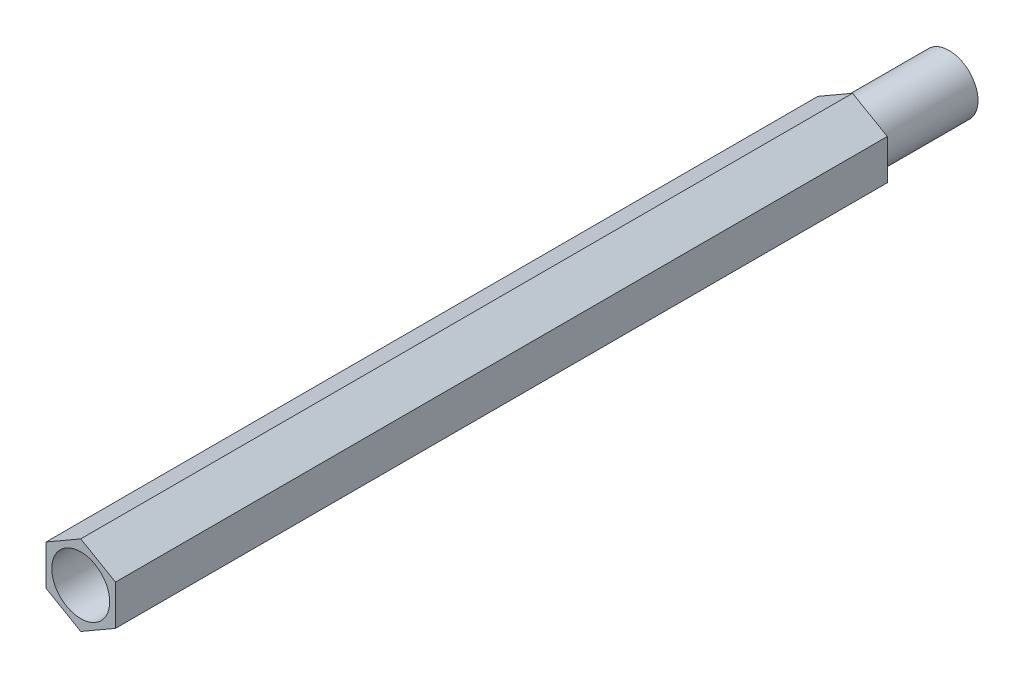
ISO-10303-21;
HEADER;
FILE_DESCRIPTION(('STEP AP214'),'2;1');
FILE_NAME('part.step','',(''),(''),'','','');
FILE_SCHEMA(('AUTOMOTIVE_DESIGN { 1 0 10303 214 1 1 1 1 }'));
ENDSEC;
DATA;
#1=APPLICATION_CONTEXT('core data for automotive mechanical design processes');
#2=APPLICATION_PROTOCOL_DEFINITION('international standard','automotive_design',2000,#1);
#3=PRODUCT_CONTEXT('',#1,'mechanical');
#4=PRODUCT('Part','Part','',(#3));
#5=PRODUCT_RELATED_PRODUCT_CATEGORY('part','',(#4));
#6=PRODUCT_DEFINITION_FORMATION('','',#4);
#7=PRODUCT_DEFINITION_CONTEXT('part definition',#1,'design');
#8=PRODUCT_DEFINITION('design','',#6,#7);
#9=PRODUCT_DEFINITION_SHAPE('','',#8);
#10=(LENGTH_UNIT() NAMED_UNIT(*) SI_UNIT(.MILLI.,.METRE.));
#11=(NAMED_UNIT(*) PLANE_ANGLE_UNIT() SI_UNIT($,.RADIAN.));
#12=(NAMED_UNIT(*) SI_UNIT($,.STERADIAN.) SOLID_ANGLE_UNIT());
#13=UNCERTAINTY_MEASURE_WITH_UNIT(LENGTH_MEASURE(1.E-05),#10,'distance_accuracy_value','');
#14=(GEOMETRIC_REPRESENTATION_CONTEXT(3) GLOBAL_UNCERTAINTY_ASSIGNED_CONTEXT((#13)) GLOBAL_UNIT_ASSIGNED_CONTEXT((#10,
#11,#12)) REPRESENTATION_CONTEXT('',''));
#15=CARTESIAN_POINT('',(0.,0.,0.));
#16=DIRECTION('',(0.,0.,1.));
#17=DIRECTION('',(1.,0.,0.));
#18=AXIS2_PLACEMENT_3D('',#15,#16,#17);
#19=CARTESIAN_POINT('',(0.,0.,40.));
#20=DIRECTION('',(0.,0.,-1.));
#21=DIRECTION('',(-1.,0.,0.));
#22=AXIS2_PLACEMENT_3D('',#19,#20,#21);
#23=CYLINDRICAL_SURFACE('',#22,1.5);
#24=CARTESIAN_POINT('',(0.,0.,40.));
#25=DIRECTION('',(0.,0.,1.));
#26=DIRECTION('',(1.,0.,0.));
#27=AXIS2_PLACEMENT_3D('',#24,#25,#26);
#28=CIRCLE('',#27,1.5);
#29=CARTESIAN_POINT('',(1.5,0.,40.));
#30=VERTEX_POINT('',#29);
#31=EDGE_CURVE('E141',#30,#30,#28,.T.);
#32=ORIENTED_EDGE('',*,*,#31,.T.);
#33=EDGE_LOOP('',(#32));
#34=FACE_BOUND('',#33,.T.);
#35=CARTESIAN_POINT('',(0.,0.,5.));
#36=DIRECTION('',(0.,0.,-1.));
#37=DIRECTION('',(-1.,0.,0.));
#38=AXIS2_PLACEMENT_3D('',#35,#36,#37);
#39=CIRCLE('',#38,1.5);
#40=CARTESIAN_POINT('',(-1.5,0.,5.));
#41=VERTEX_POINT('',#40);
#42=EDGE_CURVE('E258',#41,#41,#39,.T.);
#43=ORIENTED_EDGE('',*,*,#42,.T.);
#44=EDGE_LOOP('',(#43));
#45=FACE_BOUND('',#44,.T.);
#46=ADVANCED_FACE('F45',(#34,#45),#23,.F.);
#47=CARTESIAN_POINT('',(0.,0.,40.));
#48=DIRECTION('',(0.,0.,1.));
#49=DIRECTION('',(1.,0.,0.));
#50=AXIS2_PLACEMENT_3D('',#47,#48,#49);
#51=PLANE('',#50);
#52=DIRECTION('',(-0.866025403784439,0.5,0.));
#53=VECTOR('',#52,1.);
#54=CARTESIAN_POINT('',(1.8,1.03923048454133,40.));
#55=LINE('',#54,#53);
#56=CARTESIAN_POINT('',(1.8,1.03923048454133,40.));
#57=VERTEX_POINT('',#56);
#58=CARTESIAN_POINT('',(0.,2.07846096908265,40.));
#59=VERTEX_POINT('',#58);
#60=EDGE_CURVE('E153',#57,#59,#55,.T.);
#61=ORIENTED_EDGE('',*,*,#60,.T.);
#62=DIRECTION('',(-0.866025403784439,-0.5,0.));
#63=VECTOR('',#62,1.);
#64=CARTESIAN_POINT('',(0.,2.07846096908265,40.));
#65=LINE('',#64,#63);
#66=CARTESIAN_POINT('',(-1.8,1.03923048454133,40.));
#67=VERTEX_POINT('',#66);
#68=EDGE_CURVE('E100',#59,#67,#65,.T.);
#69=ORIENTED_EDGE('',*,*,#68,.T.);
#70=DIRECTION('',(0.,-1.,0.));
#71=VECTOR('',#70,1.);
#72=CARTESIAN_POINT('',(-1.8,1.03923048454133,40.));
#73=LINE('',#72,#71);
#74=CARTESIAN_POINT('',(-1.8,-1.03923048454133,40.));
#75=VERTEX_POINT('',#74);
#76=EDGE_CURVE('E114',#67,#75,#73,.T.);
#77=ORIENTED_EDGE('',*,*,#76,.T.);
#78=DIRECTION('',(0.866025403784439,-0.5,0.));
#79=VECTOR('',#78,1.);
#80=CARTESIAN_POINT('',(-1.8,-1.03923048454133,40.));
#81=LINE('',#80,#79);
#82=CARTESIAN_POINT('',(0.,-2.07846096908265,40.));
#83=VERTEX_POINT('',#82);
#84=EDGE_CURVE('E107',#75,#83,#81,.T.);
#85=ORIENTED_EDGE('',*,*,#84,.T.);
#86=DIRECTION('',(0.866025403784439,0.5,0.));
#87=VECTOR('',#86,1.);
#88=CARTESIAN_POINT('',(0.,-2.07846096908265,40.));
#89=LINE('',#88,#87);
#90=CARTESIAN_POINT('',(1.8,-1.03923048454133,40.));
#91=VERTEX_POINT('',#90);
#92=EDGE_CURVE('E112',#83,#91,#89,.T.);
#93=ORIENTED_EDGE('',*,*,#92,.T.);
#94=DIRECTION('',(0.,1.,0.));
#95=VECTOR('',#94,1.);
#96=CARTESIAN_POINT('',(1.8,-1.03923048454133,40.));
#97=LINE('',#96,#95);
#98=EDGE_CURVE('E63',#91,#57,#97,.T.);
#99=ORIENTED_EDGE('',*,*,#98,.T.);
#100=EDGE_LOOP('',(#61,#69,#77,#85,#93,#99));
#101=FACE_BOUND('',#100,.T.);
#102=ORIENTED_EDGE('',*,*,#31,.F.);
#103=EDGE_LOOP('',(#102));
#104=FACE_BOUND('',#103,.T.);
#105=ADVANCED_FACE('F109',(#101,#104),#51,.T.);
#106=CARTESIAN_POINT('',(0.,0.,0.));
#107=DIRECTION('',(0.,0.,1.));
#108=DIRECTION('',(1.,0.,0.));
#109=AXIS2_PLACEMENT_3D('',#106,#107,#108);
#110=PLANE('',#109);
#111=DIRECTION('',(-0.866025403784439,0.5,0.));
#112=VECTOR('',#111,1.);
#113=CARTESIAN_POINT('',(1.8,1.03923048454133,0.));
#114=LINE('',#113,#112);
#115=CARTESIAN_POINT('',(1.8,1.03923048454133,0.));
#116=VERTEX_POINT('',#115);
#117=CARTESIAN_POINT('',(0.,2.07846096908265,0.));
#118=VERTEX_POINT('',#117);
#119=EDGE_CURVE('E136',#116,#118,#114,.T.);
#120=ORIENTED_EDGE('',*,*,#119,.F.);
#121=DIRECTION('',(0.,1.,0.));
#122=VECTOR('',#121,1.);
#123=CARTESIAN_POINT('',(1.8,-1.03923048454133,0.));
#124=LINE('',#123,#122);
#125=CARTESIAN_POINT('',(1.8,-1.03923048454133,0.));
#126=VERTEX_POINT('',#125);
#127=EDGE_CURVE('E92',#126,#116,#124,.T.);
#128=ORIENTED_EDGE('',*,*,#127,.F.);
#129=DIRECTION('',(0.866025403784439,0.5,0.));
#130=VECTOR('',#129,1.);
#131=CARTESIAN_POINT('',(0.,-2.07846096908265,0.));
#132=LINE('',#131,#130);
#133=CARTESIAN_POINT('',(0.,-2.07846096908265,0.));
#134=VERTEX_POINT('',#133);
#135=EDGE_CURVE('E86',#134,#126,#132,.T.);
#136=ORIENTED_EDGE('',*,*,#135,.F.);
#137=DIRECTION('',(0.866025403784439,-0.5,0.));
#138=VECTOR('',#137,1.);
#139=CARTESIAN_POINT('',(-1.8,-1.03923048454133,0.));
#140=LINE('',#139,#138);
#141=CARTESIAN_POINT('',(-1.8,-1.03923048454133,0.));
#142=VERTEX_POINT('',#141);
#143=EDGE_CURVE('E123',#142,#134,#140,.T.);
#144=ORIENTED_EDGE('',*,*,#143,.F.);
#145=DIRECTION('',(0.,-1.,0.));
#146=VECTOR('',#145,1.);
#147=CARTESIAN_POINT('',(-1.8,1.03923048454133,0.));
#148=LINE('',#147,#146);
#149=CARTESIAN_POINT('',(-1.8,1.03923048454133,0.));
#150=VERTEX_POINT('',#149);
#151=EDGE_CURVE('E144',#150,#142,#148,.T.);
#152=ORIENTED_EDGE('',*,*,#151,.F.);
#153=DIRECTION('',(-0.866025403784439,-0.5,0.));
#154=VECTOR('',#153,1.);
#155=CARTESIAN_POINT('',(0.,2.07846096908265,0.));
#156=LINE('',#155,#154);
#157=EDGE_CURVE('E140',#118,#150,#156,.T.);
#158=ORIENTED_EDGE('',*,*,#157,.F.);
#159=EDGE_LOOP('',(#120,#128,#136,#144,#152,#158));
#160=FACE_BOUND('',#159,.T.);
#161=CARTESIAN_POINT('',(0.,0.,0.));
#162=DIRECTION('',(0.,0.,1.));
#163=DIRECTION('',(1.,0.,0.));
#164=AXIS2_PLACEMENT_3D('',#161,#162,#163);
#165=CIRCLE('',#164,1.5);
#166=CARTESIAN_POINT('',(1.5,0.,0.));
#167=VERTEX_POINT('',#166);
#168=EDGE_CURVE('E257',#167,#167,#165,.F.);
#169=ORIENTED_EDGE('',*,*,#168,.F.);
#170=EDGE_LOOP('',(#169));
#171=FACE_BOUND('',#170,.T.);
#172=ADVANCED_FACE('F166',(#160,#171),#110,.F.);
#173=CARTESIAN_POINT('',(1.8,1.03923048454133,40.));
#174=DIRECTION('',(-0.5,-0.866025403784439,0.));
#175=DIRECTION('',(0.866025403784439,-0.5,0.));
#176=AXIS2_PLACEMENT_3D('',#173,#174,#175);
#177=PLANE('',#176);
#178=ORIENTED_EDGE('',*,*,#119,.T.);
#179=DIRECTION('',(0.,0.,-1.));
#180=VECTOR('',#179,1.);
#181=CARTESIAN_POINT('',(0.,2.07846096908265,40.));
#182=LINE('',#181,#180);
#183=EDGE_CURVE('E11',#59,#118,#182,.T.);
#184=ORIENTED_EDGE('',*,*,#183,.F.);
#185=ORIENTED_EDGE('',*,*,#60,.F.);
#186=DIRECTION('',(0.,0.,-1.));
#187=VECTOR('',#186,1.);
#188=CARTESIAN_POINT('',(1.8,1.03923048454133,40.));
#189=LINE('',#188,#187);
#190=EDGE_CURVE('E132',#57,#116,#189,.T.);
#191=ORIENTED_EDGE('',*,*,#190,.T.);
#192=EDGE_LOOP('',(#178,#184,#185,#191));
#193=FACE_BOUND('',#192,.T.);
#194=ADVANCED_FACE('F47',(#193),#177,.F.);
#195=CARTESIAN_POINT('',(0.,2.07846096908265,40.));
#196=DIRECTION('',(0.5,-0.866025403784438,0.));
#197=DIRECTION('',(0.866025403784439,0.5,0.));
#198=AXIS2_PLACEMENT_3D('',#195,#196,#197);
#199=PLANE('',#198);
#200=ORIENTED_EDGE('',*,*,#157,.T.);
#201=DIRECTION('',(0.,0.,-1.));
#202=VECTOR('',#201,1.);
#203=CARTESIAN_POINT('',(-1.8,1.03923048454133,40.));
#204=LINE('',#203,#202);
#205=EDGE_CURVE('E55',#67,#150,#204,.T.);
#206=ORIENTED_EDGE('',*,*,#205,.F.);
#207=ORIENTED_EDGE('',*,*,#68,.F.);
#208=ORIENTED_EDGE('',*,*,#183,.T.);
#209=EDGE_LOOP('',(#200,#206,#207,#208));
#210=FACE_BOUND('',#209,.T.);
#211=ADVANCED_FACE('F198',(#210),#199,.F.);
#212=CARTESIAN_POINT('',(-1.8,1.03923048454133,40.));
#213=DIRECTION('',(1.,0.,0.));
#214=DIRECTION('',(0.,1.,0.));
#215=AXIS2_PLACEMENT_3D('',#212,#213,#214);
#216=PLANE('',#215);
#217=ORIENTED_EDGE('',*,*,#151,.T.);
#218=DIRECTION('',(0.,0.,-1.));
#219=VECTOR('',#218,1.);
#220=CARTESIAN_POINT('',(-1.8,-1.03923048454133,40.));
#221=LINE('',#220,#219);
#222=EDGE_CURVE('E125',#75,#142,#221,.T.);
#223=ORIENTED_EDGE('',*,*,#222,.F.);
#224=ORIENTED_EDGE('',*,*,#76,.F.);
#225=ORIENTED_EDGE('',*,*,#205,.T.);
#226=EDGE_LOOP('',(#217,#223,#224,#225));
#227=FACE_BOUND('',#226,.T.);
#228=ADVANCED_FACE('F163',(#227),#216,.F.);
#229=CARTESIAN_POINT('',(-1.8,-1.03923048454133,40.));
#230=DIRECTION('',(0.5,0.866025403784439,0.));
#231=DIRECTION('',(-0.866025403784439,0.5,0.));
#232=AXIS2_PLACEMENT_3D('',#229,#230,#231);
#233=PLANE('',#232);
#234=ORIENTED_EDGE('',*,*,#143,.T.);
#235=DIRECTION('',(0.,0.,-1.));
#236=VECTOR('',#235,1.);
#237=CARTESIAN_POINT('',(0.,-2.07846096908265,40.));
#238=LINE('',#237,#236);
#239=EDGE_CURVE('E120',#83,#134,#238,.T.);
#240=ORIENTED_EDGE('',*,*,#239,.F.);
#241=ORIENTED_EDGE('',*,*,#84,.F.);
#242=ORIENTED_EDGE('',*,*,#222,.T.);
#243=EDGE_LOOP('',(#234,#240,#241,#242));
#244=FACE_BOUND('',#243,.T.);
#245=ADVANCED_FACE('F121',(#244),#233,.F.);
#246=CARTESIAN_POINT('',(0.,-2.07846096908265,40.));
#247=DIRECTION('',(-0.5,0.866025403784439,0.));
#248=DIRECTION('',(-0.866025403784439,-0.5,0.));
#249=AXIS2_PLACEMENT_3D('',#246,#247,#248);
#250=PLANE('',#249);
#251=ORIENTED_EDGE('',*,*,#135,.T.);
#252=DIRECTION('',(0.,0.,-1.));
#253=VECTOR('',#252,1.);
#254=CARTESIAN_POINT('',(1.8,-1.03923048454133,40.));
#255=LINE('',#254,#253);
#256=EDGE_CURVE('E126',#91,#126,#255,.T.);
#257=ORIENTED_EDGE('',*,*,#256,.F.);
#258=ORIENTED_EDGE('',*,*,#92,.F.);
#259=ORIENTED_EDGE('',*,*,#239,.T.);
#260=EDGE_LOOP('',(#251,#257,#258,#259));
#261=FACE_BOUND('',#260,.T.);
#262=ADVANCED_FACE('F128',(#261),#250,.F.);
#263=CARTESIAN_POINT('',(1.8,-1.03923048454133,40.));
#264=DIRECTION('',(-1.,0.,0.));
#265=DIRECTION('',(0.,-1.,0.));
#266=AXIS2_PLACEMENT_3D('',#263,#264,#265);
#267=PLANE('',#266);
#268=ORIENTED_EDGE('',*,*,#127,.T.);
#269=ORIENTED_EDGE('',*,*,#190,.F.);
#270=ORIENTED_EDGE('',*,*,#98,.F.);
#271=ORIENTED_EDGE('',*,*,#256,.T.);
#272=EDGE_LOOP('',(#268,#269,#270,#271));
#273=FACE_BOUND('',#272,.T.);
#274=ADVANCED_FACE('F171',(#273),#267,.F.);
#275=CARTESIAN_POINT('',(0.,0.,5.));
#276=DIRECTION('',(0.,0.,-1.));
#277=DIRECTION('',(-1.,0.,0.));
#278=AXIS2_PLACEMENT_3D('',#275,#276,#277);
#279=PLANE('',#278);
#280=ORIENTED_EDGE('',*,*,#42,.F.);
#281=EDGE_LOOP('',(#280));
#282=FACE_BOUND('',#281,.T.);
#283=ADVANCED_FACE('F173',(#282),#279,.F.);
#284=CARTESIAN_POINT('',(0.,0.,-5.));
#285=DIRECTION('',(0.,0.,1.));
#286=DIRECTION('',(1.,0.,0.));
#287=AXIS2_PLACEMENT_3D('',#284,#285,#286);
#288=CYLINDRICAL_SURFACE('',#287,1.5);
#289=CARTESIAN_POINT('',(0.,0.,-5.));
#290=DIRECTION('',(0.,0.,-1.));
#291=DIRECTION('',(-1.,0.,0.));
#292=AXIS2_PLACEMENT_3D('',#289,#290,#291);
#293=CIRCLE('',#292,1.5);
#294=CARTESIAN_POINT('',(-1.5,0.,-5.));
#295=VERTEX_POINT('',#294);
#296=EDGE_CURVE('E255',#295,#295,#293,.T.);
#297=ORIENTED_EDGE('',*,*,#296,.F.);
#298=EDGE_LOOP('',(#297));
#299=FACE_BOUND('',#298,.T.);
#300=ORIENTED_EDGE('',*,*,#168,.T.);
#301=EDGE_LOOP('',(#300));
#302=FACE_BOUND('',#301,.T.);
#303=ADVANCED_FACE('F180',(#299,#302),#288,.T.);
#304=CARTESIAN_POINT('',(0.,0.,-5.));
#305=DIRECTION('',(0.,0.,-1.));
#306=DIRECTION('',(-1.,0.,0.));
#307=AXIS2_PLACEMENT_3D('',#304,#305,#306);
#308=PLANE('',#307);
#309=ORIENTED_EDGE('',*,*,#296,.T.);
#310=EDGE_LOOP('',(#309));
#311=FACE_BOUND('',#310,.T.);
#312=ADVANCED_FACE('F241',(#311),#308,.T.);
#313=CLOSED_SHELL('',(#46,#105,#172,#194,#211,#228,#245,#262,#274,#283,#303,#312));
#314=MANIFOLD_SOLID_BREP('B2',#313);
#315=ADVANCED_BREP_SHAPE_REPRESENTATION('',(#18,#314),#14);
#316=SHAPE_DEFINITION_REPRESENTATION(#9,#315);
ENDSEC;
END-ISO-10303-21;
